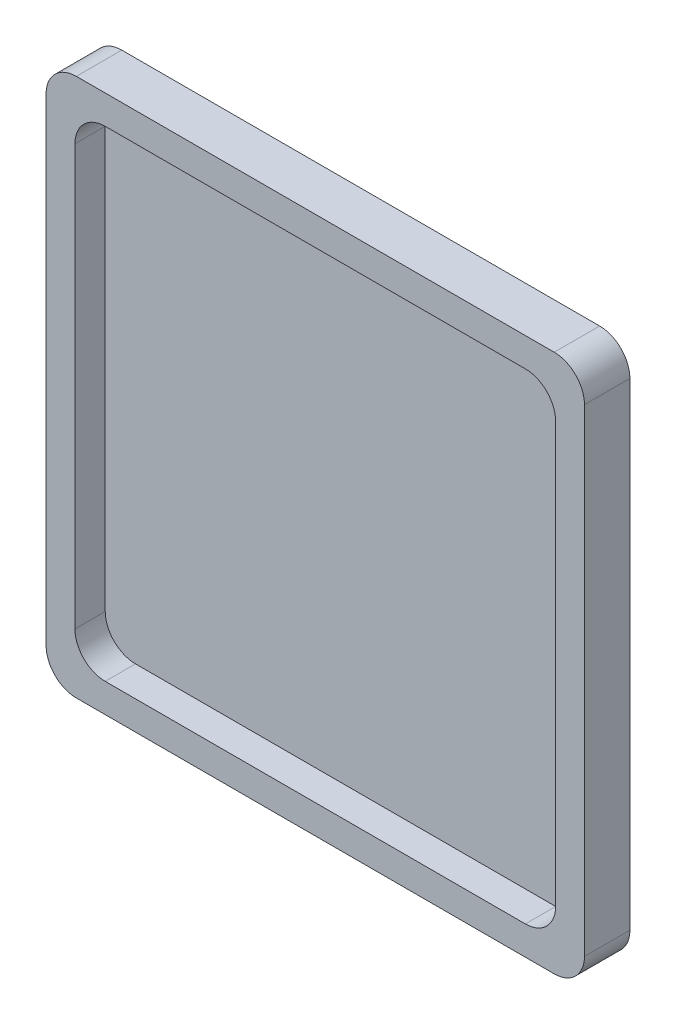
ISO-10303-21;
HEADER;
FILE_DESCRIPTION(('STEP AP214'),'2;1');
FILE_NAME('part.step','',(''),(''),'','','');
FILE_SCHEMA(('AUTOMOTIVE_DESIGN { 1 0 10303 214 1 1 1 1 }'));
ENDSEC;
DATA;
#1=APPLICATION_CONTEXT('core data for automotive mechanical design processes');
#2=APPLICATION_PROTOCOL_DEFINITION('international standard','automotive_design',2000,#1);
#3=PRODUCT_CONTEXT('',#1,'mechanical');
#4=PRODUCT('Part','Part','',(#3));
#5=PRODUCT_RELATED_PRODUCT_CATEGORY('part','',(#4));
#6=PRODUCT_DEFINITION_FORMATION('','',#4);
#7=PRODUCT_DEFINITION_CONTEXT('part definition',#1,'design');
#8=PRODUCT_DEFINITION('design','',#6,#7);
#9=PRODUCT_DEFINITION_SHAPE('','',#8);
#10=(LENGTH_UNIT() NAMED_UNIT(*) SI_UNIT(.MILLI.,.METRE.));
#11=(NAMED_UNIT(*) PLANE_ANGLE_UNIT() SI_UNIT($,.RADIAN.));
#12=(NAMED_UNIT(*) SI_UNIT($,.STERADIAN.) SOLID_ANGLE_UNIT());
#13=UNCERTAINTY_MEASURE_WITH_UNIT(LENGTH_MEASURE(1.E-05),#10,'distance_accuracy_value','');
#14=(GEOMETRIC_REPRESENTATION_CONTEXT(3) GLOBAL_UNCERTAINTY_ASSIGNED_CONTEXT((#13)) GLOBAL_UNIT_ASSIGNED_CONTEXT((#10,
#11,#12)) REPRESENTATION_CONTEXT('',''));
#15=CARTESIAN_POINT('',(0.,0.,0.));
#16=DIRECTION('',(0.,0.,1.));
#17=DIRECTION('',(1.,0.,0.));
#18=AXIS2_PLACEMENT_3D('',#15,#16,#17);
#19=CARTESIAN_POINT('',(0.,0.,0.));
#20=DIRECTION('',(0.,0.,1.));
#21=DIRECTION('',(1.,0.,0.));
#22=AXIS2_PLACEMENT_3D('',#19,#20,#21);
#23=PLANE('',#22);
#24=DIRECTION('',(0.,1.,0.));
#25=VECTOR('',#24,1.);
#26=CARTESIAN_POINT('',(186.685967034508,138.282663918857,0.));
#27=LINE('',#26,#25);
#28=CARTESIAN_POINT('',(186.685967034508,-29.5173360811433,0.));
#29=VERTEX_POINT('',#28);
#30=CARTESIAN_POINT('',(186.685967034508,128.282663918857,0.));
#31=VERTEX_POINT('',#30);
#32=EDGE_CURVE('E242',#29,#31,#27,.T.);
#33=ORIENTED_EDGE('',*,*,#32,.F.);
#34=CARTESIAN_POINT('',(176.685967034508,-29.5173360811433,0.));
#35=DIRECTION('',(0.,0.,1.));
#36=DIRECTION('',(1.,0.,0.));
#37=AXIS2_PLACEMENT_3D('',#34,#35,#36);
#38=CIRCLE('',#37,10.);
#39=CARTESIAN_POINT('',(176.685967034508,-39.5173360811434,0.));
#40=VERTEX_POINT('',#39);
#41=EDGE_CURVE('E257',#29,#40,#38,.F.);
#42=ORIENTED_EDGE('',*,*,#41,.T.);
#43=DIRECTION('',(1.,0.,0.));
#44=VECTOR('',#43,1.);
#45=CARTESIAN_POINT('',(8.88596703450786,-39.5173360811434,0.));
#46=LINE('',#45,#44);
#47=CARTESIAN_POINT('',(18.8859670345079,-39.5173360811434,0.));
#48=VERTEX_POINT('',#47);
#49=EDGE_CURVE('E239',#48,#40,#46,.T.);
#50=ORIENTED_EDGE('',*,*,#49,.F.);
#51=CARTESIAN_POINT('',(18.8859670345079,-29.5173360811434,0.));
#52=DIRECTION('',(0.,0.,1.));
#53=DIRECTION('',(1.,0.,0.));
#54=AXIS2_PLACEMENT_3D('',#51,#52,#53);
#55=CIRCLE('',#54,10.);
#56=CARTESIAN_POINT('',(8.88596703450786,-29.5173360811433,0.));
#57=VERTEX_POINT('',#56);
#58=EDGE_CURVE('E253',#48,#57,#55,.F.);
#59=ORIENTED_EDGE('',*,*,#58,.T.);
#60=DIRECTION('',(0.,-1.,0.));
#61=VECTOR('',#60,1.);
#62=CARTESIAN_POINT('',(8.88596703450784,138.282663918857,0.));
#63=LINE('',#62,#61);
#64=CARTESIAN_POINT('',(8.88596703450784,128.282663918857,0.));
#65=VERTEX_POINT('',#64);
#66=EDGE_CURVE('E214',#65,#57,#63,.T.);
#67=ORIENTED_EDGE('',*,*,#66,.F.);
#68=CARTESIAN_POINT('',(18.8859670345078,128.282663918857,0.));
#69=DIRECTION('',(0.,0.,1.));
#70=DIRECTION('',(1.,0.,0.));
#71=AXIS2_PLACEMENT_3D('',#68,#69,#70);
#72=CIRCLE('',#71,10.);
#73=CARTESIAN_POINT('',(18.8859670345078,138.282663918857,0.));
#74=VERTEX_POINT('',#73);
#75=EDGE_CURVE('E251',#65,#74,#72,.F.);
#76=ORIENTED_EDGE('',*,*,#75,.T.);
#77=DIRECTION('',(-1.,0.,0.));
#78=VECTOR('',#77,1.);
#79=CARTESIAN_POINT('',(8.88596703450784,138.282663918857,0.));
#80=LINE('',#79,#78);
#81=CARTESIAN_POINT('',(176.685967034508,138.282663918857,0.));
#82=VERTEX_POINT('',#81);
#83=EDGE_CURVE('E227',#82,#74,#80,.T.);
#84=ORIENTED_EDGE('',*,*,#83,.F.);
#85=CARTESIAN_POINT('',(176.685967034508,128.282663918857,0.));
#86=DIRECTION('',(0.,0.,1.));
#87=DIRECTION('',(1.,0.,0.));
#88=AXIS2_PLACEMENT_3D('',#85,#86,#87);
#89=CIRCLE('',#88,10.);
#90=EDGE_CURVE('E255',#82,#31,#89,.F.);
#91=ORIENTED_EDGE('',*,*,#90,.T.);
#92=EDGE_LOOP('',(#33,#42,#50,#59,#67,#76,#84,#91));
#93=FACE_BOUND('',#92,.T.);
#94=DIRECTION('',(0.,-1.,0.));
#95=VECTOR('',#94,1.);
#96=CARTESIAN_POINT('',(129.535967034508,17.6326639188566,0.));
#97=LINE('',#96,#95);
#98=CARTESIAN_POINT('',(129.535967034508,81.1326639188567,0.));
#99=VERTEX_POINT('',#98);
#100=CARTESIAN_POINT('',(129.535967034508,17.6326639188566,0.));
#101=VERTEX_POINT('',#100);
#102=EDGE_CURVE('E52',#99,#101,#97,.T.);
#103=ORIENTED_EDGE('',*,*,#102,.F.);
#104=DIRECTION('',(1.,0.,0.));
#105=VECTOR('',#104,1.);
#106=CARTESIAN_POINT('',(129.535967034508,81.1326639188567,0.));
#107=LINE('',#106,#105);
#108=CARTESIAN_POINT('',(66.0359670345078,81.1326639188567,0.));
#109=VERTEX_POINT('',#108);
#110=EDGE_CURVE('E56',#109,#99,#107,.T.);
#111=ORIENTED_EDGE('',*,*,#110,.F.);
#112=DIRECTION('',(0.,1.,0.));
#113=VECTOR('',#112,1.);
#114=CARTESIAN_POINT('',(66.0359670345078,17.6326639188566,0.));
#115=LINE('',#114,#113);
#116=CARTESIAN_POINT('',(66.0359670345078,17.6326639188566,0.));
#117=VERTEX_POINT('',#116);
#118=EDGE_CURVE('E587',#117,#109,#115,.T.);
#119=ORIENTED_EDGE('',*,*,#118,.F.);
#120=DIRECTION('',(-1.,0.,0.));
#121=VECTOR('',#120,1.);
#122=CARTESIAN_POINT('',(129.535967034508,17.6326639188566,0.));
#123=LINE('',#122,#121);
#124=EDGE_CURVE('E593',#101,#117,#123,.T.);
#125=ORIENTED_EDGE('',*,*,#124,.F.);
#126=EDGE_LOOP('',(#103,#111,#119,#125));
#127=FACE_BOUND('',#126,.T.);
#128=ADVANCED_FACE('F37',(#93,#127),#23,.F.);
#129=CARTESIAN_POINT('',(8.88596703450784,138.282663918857,15.));
#130=DIRECTION('',(1.,0.,0.));
#131=DIRECTION('',(0.,1.,0.));
#132=AXIS2_PLACEMENT_3D('',#129,#130,#131);
#133=PLANE('',#132);
#134=ORIENTED_EDGE('',*,*,#66,.T.);
#135=DIRECTION('',(0.,0.,-1.));
#136=VECTOR('',#135,1.);
#137=CARTESIAN_POINT('',(8.88596703450786,-29.5173360811433,15.));
#138=LINE('',#137,#136);
#139=CARTESIAN_POINT('',(8.88596703450786,-29.5173360811433,15.));
#140=VERTEX_POINT('',#139);
#141=EDGE_CURVE('E308',#57,#140,#138,.F.);
#142=ORIENTED_EDGE('',*,*,#141,.T.);
#143=DIRECTION('',(0.,-1.,0.));
#144=VECTOR('',#143,1.);
#145=CARTESIAN_POINT('',(8.88596703450784,138.282663918857,15.));
#146=LINE('',#145,#144);
#147=CARTESIAN_POINT('',(8.88596703450784,128.282663918857,15.));
#148=VERTEX_POINT('',#147);
#149=EDGE_CURVE('E223',#148,#140,#146,.T.);
#150=ORIENTED_EDGE('',*,*,#149,.F.);
#151=DIRECTION('',(0.,0.,-1.));
#152=VECTOR('',#151,1.);
#153=CARTESIAN_POINT('',(8.88596703450784,128.282663918857,15.));
#154=LINE('',#153,#152);
#155=EDGE_CURVE('E305',#148,#65,#154,.T.);
#156=ORIENTED_EDGE('',*,*,#155,.T.);
#157=EDGE_LOOP('',(#134,#142,#150,#156));
#158=FACE_BOUND('',#157,.T.);
#159=ADVANCED_FACE('F365',(#158),#133,.F.);
#160=CARTESIAN_POINT('',(8.88596703450786,-39.5173360811434,15.));
#161=DIRECTION('',(0.,1.,0.));
#162=DIRECTION('',(0.,0.,1.));
#163=AXIS2_PLACEMENT_3D('',#160,#161,#162);
#164=PLANE('',#163);
#165=ORIENTED_EDGE('',*,*,#49,.T.);
#166=DIRECTION('',(0.,0.,-1.));
#167=VECTOR('',#166,1.);
#168=CARTESIAN_POINT('',(176.685967034508,-39.5173360811434,15.));
#169=LINE('',#168,#167);
#170=CARTESIAN_POINT('',(176.685967034508,-39.5173360811434,15.));
#171=VERTEX_POINT('',#170);
#172=EDGE_CURVE('E262',#40,#171,#169,.F.);
#173=ORIENTED_EDGE('',*,*,#172,.T.);
#174=DIRECTION('',(1.,0.,0.));
#175=VECTOR('',#174,1.);
#176=CARTESIAN_POINT('',(8.88596703450786,-39.5173360811434,15.));
#177=LINE('',#176,#175);
#178=CARTESIAN_POINT('',(18.8859670345079,-39.5173360811434,15.));
#179=VERTEX_POINT('',#178);
#180=EDGE_CURVE('E226',#179,#171,#177,.T.);
#181=ORIENTED_EDGE('',*,*,#180,.F.);
#182=DIRECTION('',(0.,0.,-1.));
#183=VECTOR('',#182,1.);
#184=CARTESIAN_POINT('',(18.8859670345079,-39.5173360811434,15.));
#185=LINE('',#184,#183);
#186=EDGE_CURVE('E259',#179,#48,#185,.T.);
#187=ORIENTED_EDGE('',*,*,#186,.T.);
#188=EDGE_LOOP('',(#165,#173,#181,#187));
#189=FACE_BOUND('',#188,.T.);
#190=ADVANCED_FACE('F371',(#189),#164,.F.);
#191=CARTESIAN_POINT('',(186.685967034508,138.282663918857,15.));
#192=DIRECTION('',(-1.,0.,0.));
#193=DIRECTION('',(0.,0.,1.));
#194=AXIS2_PLACEMENT_3D('',#191,#192,#193);
#195=PLANE('',#194);
#196=DIRECTION('',(0.,1.,0.));
#197=VECTOR('',#196,1.);
#198=CARTESIAN_POINT('',(186.685967034508,138.282663918857,15.));
#199=LINE('',#198,#197);
#200=CARTESIAN_POINT('',(186.685967034508,-29.5173360811433,15.));
#201=VERTEX_POINT('',#200);
#202=CARTESIAN_POINT('',(186.685967034508,128.282663918857,15.));
#203=VERTEX_POINT('',#202);
#204=EDGE_CURVE('E230',#201,#203,#199,.T.);
#205=ORIENTED_EDGE('',*,*,#204,.F.);
#206=DIRECTION('',(0.,0.,-1.));
#207=VECTOR('',#206,1.);
#208=CARTESIAN_POINT('',(186.685967034508,-29.5173360811433,15.));
#209=LINE('',#208,#207);
#210=EDGE_CURVE('E248',#201,#29,#209,.T.);
#211=ORIENTED_EDGE('',*,*,#210,.T.);
#212=ORIENTED_EDGE('',*,*,#32,.T.);
#213=DIRECTION('',(0.,0.,-1.));
#214=VECTOR('',#213,1.);
#215=CARTESIAN_POINT('',(186.685967034508,128.282663918857,15.));
#216=LINE('',#215,#214);
#217=EDGE_CURVE('E236',#31,#203,#216,.F.);
#218=ORIENTED_EDGE('',*,*,#217,.T.);
#219=EDGE_LOOP('',(#205,#211,#212,#218));
#220=FACE_BOUND('',#219,.T.);
#221=ADVANCED_FACE('F381',(#220),#195,.F.);
#222=CARTESIAN_POINT('',(8.88596703450784,138.282663918857,15.));
#223=DIRECTION('',(0.,-1.,0.));
#224=DIRECTION('',(0.,0.,-1.));
#225=AXIS2_PLACEMENT_3D('',#222,#223,#224);
#226=PLANE('',#225);
#227=DIRECTION('',(-1.,0.,0.));
#228=VECTOR('',#227,1.);
#229=CARTESIAN_POINT('',(8.88596703450784,138.282663918857,15.));
#230=LINE('',#229,#228);
#231=CARTESIAN_POINT('',(176.685967034508,138.282663918857,15.));
#232=VERTEX_POINT('',#231);
#233=CARTESIAN_POINT('',(18.8859670345078,138.282663918857,15.));
#234=VERTEX_POINT('',#233);
#235=EDGE_CURVE('E233',#232,#234,#230,.T.);
#236=ORIENTED_EDGE('',*,*,#235,.F.);
#237=DIRECTION('',(0.,0.,-1.));
#238=VECTOR('',#237,1.);
#239=CARTESIAN_POINT('',(176.685967034508,138.282663918857,15.));
#240=LINE('',#239,#238);
#241=EDGE_CURVE('E302',#232,#82,#240,.T.);
#242=ORIENTED_EDGE('',*,*,#241,.T.);
#243=ORIENTED_EDGE('',*,*,#83,.T.);
#244=DIRECTION('',(0.,0.,-1.));
#245=VECTOR('',#244,1.);
#246=CARTESIAN_POINT('',(18.8859670345078,138.282663918857,15.));
#247=LINE('',#246,#245);
#248=EDGE_CURVE('E300',#74,#234,#247,.F.);
#249=ORIENTED_EDGE('',*,*,#248,.T.);
#250=EDGE_LOOP('',(#236,#242,#243,#249));
#251=FACE_BOUND('',#250,.T.);
#252=ADVANCED_FACE('F378',(#251),#226,.F.);
#253=CARTESIAN_POINT('',(0.,0.,15.));
#254=DIRECTION('',(0.,0.,1.));
#255=DIRECTION('',(1.,0.,0.));
#256=AXIS2_PLACEMENT_3D('',#253,#254,#255);
#257=PLANE('',#256);
#258=DIRECTION('',(0.,1.,0.));
#259=VECTOR('',#258,1.);
#260=CARTESIAN_POINT('',(177.160967034508,-29.9923360811434,15.));
#261=LINE('',#260,#259);
#262=CARTESIAN_POINT('',(177.160967034508,-19.9923360811434,15.));
#263=VERTEX_POINT('',#262);
#264=CARTESIAN_POINT('',(177.160967034508,118.757663918857,15.));
#265=VERTEX_POINT('',#264);
#266=EDGE_CURVE('E193',#263,#265,#261,.T.);
#267=ORIENTED_EDGE('',*,*,#266,.F.);
#268=CARTESIAN_POINT('',(167.160967034508,-19.9923360811434,15.));
#269=DIRECTION('',(0.,0.,1.));
#270=DIRECTION('',(1.,0.,0.));
#271=AXIS2_PLACEMENT_3D('',#268,#269,#270);
#272=CIRCLE('',#271,10.);
#273=CARTESIAN_POINT('',(167.160967034508,-29.9923360811434,15.));
#274=VERTEX_POINT('',#273);
#275=EDGE_CURVE('E11',#263,#274,#272,.F.);
#276=ORIENTED_EDGE('',*,*,#275,.T.);
#277=DIRECTION('',(1.,0.,0.));
#278=VECTOR('',#277,1.);
#279=CARTESIAN_POINT('',(177.160967034508,-29.9923360811434,15.));
#280=LINE('',#279,#278);
#281=CARTESIAN_POINT('',(28.4109670345078,-29.9923360811434,15.));
#282=VERTEX_POINT('',#281);
#283=EDGE_CURVE('E206',#282,#274,#280,.T.);
#284=ORIENTED_EDGE('',*,*,#283,.F.);
#285=CARTESIAN_POINT('',(28.4109670345078,-19.9923360811434,15.));
#286=DIRECTION('',(0.,0.,1.));
#287=DIRECTION('',(1.,0.,0.));
#288=AXIS2_PLACEMENT_3D('',#285,#286,#287);
#289=CIRCLE('',#288,10.);
#290=CARTESIAN_POINT('',(18.4109670345078,-19.9923360811434,15.));
#291=VERTEX_POINT('',#290);
#292=EDGE_CURVE('E45',#282,#291,#289,.F.);
#293=ORIENTED_EDGE('',*,*,#292,.T.);
#294=DIRECTION('',(0.,-1.,0.));
#295=VECTOR('',#294,1.);
#296=CARTESIAN_POINT('',(18.4109670345078,-29.9923360811434,15.));
#297=LINE('',#296,#295);
#298=CARTESIAN_POINT('',(18.4109670345078,118.757663918857,15.));
#299=VERTEX_POINT('',#298);
#300=EDGE_CURVE('E218',#299,#291,#297,.T.);
#301=ORIENTED_EDGE('',*,*,#300,.F.);
#302=CARTESIAN_POINT('',(28.4109670345078,118.757663918857,15.));
#303=DIRECTION('',(0.,0.,1.));
#304=DIRECTION('',(1.,0.,0.));
#305=AXIS2_PLACEMENT_3D('',#302,#303,#304);
#306=CIRCLE('',#305,10.);
#307=CARTESIAN_POINT('',(28.4109670345078,128.757663918857,15.));
#308=VERTEX_POINT('',#307);
#309=EDGE_CURVE('E310',#299,#308,#306,.F.);
#310=ORIENTED_EDGE('',*,*,#309,.T.);
#311=DIRECTION('',(-1.,0.,0.));
#312=VECTOR('',#311,1.);
#313=CARTESIAN_POINT('',(177.160967034508,128.757663918857,15.));
#314=LINE('',#313,#312);
#315=CARTESIAN_POINT('',(167.160967034508,128.757663918857,15.));
#316=VERTEX_POINT('',#315);
#317=EDGE_CURVE('E196',#316,#308,#314,.T.);
#318=ORIENTED_EDGE('',*,*,#317,.F.);
#319=CARTESIAN_POINT('',(167.160967034508,118.757663918857,15.));
#320=DIRECTION('',(0.,0.,1.));
#321=DIRECTION('',(1.,0.,0.));
#322=AXIS2_PLACEMENT_3D('',#319,#320,#321);
#323=CIRCLE('',#322,10.);
#324=EDGE_CURVE('E312',#316,#265,#323,.F.);
#325=ORIENTED_EDGE('',*,*,#324,.T.);
#326=EDGE_LOOP('',(#267,#276,#284,#293,#301,#310,#318,#325));
#327=FACE_BOUND('',#326,.T.);
#328=ORIENTED_EDGE('',*,*,#180,.T.);
#329=CARTESIAN_POINT('',(176.685967034508,-29.5173360811433,15.));
#330=DIRECTION('',(0.,0.,1.));
#331=DIRECTION('',(1.,0.,0.));
#332=AXIS2_PLACEMENT_3D('',#329,#330,#331);
#333=CIRCLE('',#332,10.);
#334=EDGE_CURVE('E270',#171,#201,#333,.T.);
#335=ORIENTED_EDGE('',*,*,#334,.T.);
#336=ORIENTED_EDGE('',*,*,#204,.T.);
#337=CARTESIAN_POINT('',(176.685967034508,128.282663918857,15.));
#338=DIRECTION('',(0.,0.,1.));
#339=DIRECTION('',(1.,0.,0.));
#340=AXIS2_PLACEMENT_3D('',#337,#338,#339);
#341=CIRCLE('',#340,10.);
#342=EDGE_CURVE('E268',#203,#232,#341,.T.);
#343=ORIENTED_EDGE('',*,*,#342,.T.);
#344=ORIENTED_EDGE('',*,*,#235,.T.);
#345=CARTESIAN_POINT('',(18.8859670345078,128.282663918857,15.));
#346=DIRECTION('',(0.,0.,1.));
#347=DIRECTION('',(1.,0.,0.));
#348=AXIS2_PLACEMENT_3D('',#345,#346,#347);
#349=CIRCLE('',#348,10.);
#350=EDGE_CURVE('E264',#234,#148,#349,.T.);
#351=ORIENTED_EDGE('',*,*,#350,.T.);
#352=ORIENTED_EDGE('',*,*,#149,.T.);
#353=CARTESIAN_POINT('',(18.8859670345079,-29.5173360811434,15.));
#354=DIRECTION('',(0.,0.,1.));
#355=DIRECTION('',(1.,0.,0.));
#356=AXIS2_PLACEMENT_3D('',#353,#354,#355);
#357=CIRCLE('',#356,10.);
#358=EDGE_CURVE('E266',#140,#179,#357,.T.);
#359=ORIENTED_EDGE('',*,*,#358,.T.);
#360=EDGE_LOOP('',(#328,#335,#336,#343,#344,#351,#352,#359));
#361=FACE_BOUND('',#360,.T.);
#362=ADVANCED_FACE('F317',(#327,#361),#257,.T.);
#363=CARTESIAN_POINT('',(177.160967034508,-29.9923360811434,5.));
#364=DIRECTION('',(1.,0.,0.));
#365=DIRECTION('',(0.,1.,0.));
#366=AXIS2_PLACEMENT_3D('',#363,#364,#365);
#367=PLANE('',#366);
#368=ORIENTED_EDGE('',*,*,#266,.T.);
#369=DIRECTION('',(0.,0.,1.));
#370=VECTOR('',#369,1.);
#371=CARTESIAN_POINT('',(177.160967034508,118.757663918857,5.));
#372=LINE('',#371,#370);
#373=CARTESIAN_POINT('',(177.160967034508,118.757663918857,5.));
#374=VERTEX_POINT('',#373);
#375=EDGE_CURVE('E293',#265,#374,#372,.F.);
#376=ORIENTED_EDGE('',*,*,#375,.T.);
#377=DIRECTION('',(0.,1.,0.));
#378=VECTOR('',#377,1.);
#379=CARTESIAN_POINT('',(177.160967034508,-29.9923360811434,5.));
#380=LINE('',#379,#378);
#381=CARTESIAN_POINT('',(177.160967034508,-19.9923360811434,5.));
#382=VERTEX_POINT('',#381);
#383=EDGE_CURVE('E202',#382,#374,#380,.T.);
#384=ORIENTED_EDGE('',*,*,#383,.F.);
#385=DIRECTION('',(0.,0.,1.));
#386=VECTOR('',#385,1.);
#387=CARTESIAN_POINT('',(177.160967034508,-19.9923360811434,15.));
#388=LINE('',#387,#386);
#389=EDGE_CURVE('E290',#382,#263,#388,.T.);
#390=ORIENTED_EDGE('',*,*,#389,.T.);
#391=EDGE_LOOP('',(#368,#376,#384,#390));
#392=FACE_BOUND('',#391,.T.);
#393=ADVANCED_FACE('F341',(#392),#367,.F.);
#394=CARTESIAN_POINT('',(177.160967034508,-29.9923360811434,5.));
#395=DIRECTION('',(0.,-1.,0.));
#396=DIRECTION('',(1.,0.,0.));
#397=AXIS2_PLACEMENT_3D('',#394,#395,#396);
#398=PLANE('',#397);
#399=DIRECTION('',(1.,0.,0.));
#400=VECTOR('',#399,1.);
#401=CARTESIAN_POINT('',(177.160967034508,-29.9923360811434,5.));
#402=LINE('',#401,#400);
#403=CARTESIAN_POINT('',(28.4109670345078,-29.9923360811434,5.));
#404=VERTEX_POINT('',#403);
#405=CARTESIAN_POINT('',(167.160967034508,-29.9923360811434,5.));
#406=VERTEX_POINT('',#405);
#407=EDGE_CURVE('E212',#404,#406,#402,.T.);
#408=ORIENTED_EDGE('',*,*,#407,.F.);
#409=DIRECTION('',(0.,0.,1.));
#410=VECTOR('',#409,1.);
#411=CARTESIAN_POINT('',(28.4109670345078,-29.9923360811434,15.));
#412=LINE('',#411,#410);
#413=EDGE_CURVE('E297',#404,#282,#412,.T.);
#414=ORIENTED_EDGE('',*,*,#413,.T.);
#415=ORIENTED_EDGE('',*,*,#283,.T.);
#416=DIRECTION('',(0.,0.,1.));
#417=VECTOR('',#416,1.);
#418=CARTESIAN_POINT('',(167.160967034508,-29.9923360811434,5.));
#419=LINE('',#418,#417);
#420=EDGE_CURVE('E295',#274,#406,#419,.F.);
#421=ORIENTED_EDGE('',*,*,#420,.T.);
#422=EDGE_LOOP('',(#408,#414,#415,#421));
#423=FACE_BOUND('',#422,.T.);
#424=ADVANCED_FACE('F333',(#423),#398,.F.);
#425=CARTESIAN_POINT('',(18.4109670345078,-29.9923360811434,5.));
#426=DIRECTION('',(-1.,0.,0.));
#427=DIRECTION('',(0.,0.,1.));
#428=AXIS2_PLACEMENT_3D('',#425,#426,#427);
#429=PLANE('',#428);
#430=DIRECTION('',(0.,-1.,0.));
#431=VECTOR('',#430,1.);
#432=CARTESIAN_POINT('',(18.4109670345078,-29.9923360811434,5.));
#433=LINE('',#432,#431);
#434=CARTESIAN_POINT('',(18.4109670345078,118.757663918857,5.));
#435=VERTEX_POINT('',#434);
#436=CARTESIAN_POINT('',(18.4109670345078,-19.9923360811434,5.));
#437=VERTEX_POINT('',#436);
#438=EDGE_CURVE('E209',#435,#437,#433,.T.);
#439=ORIENTED_EDGE('',*,*,#438,.F.);
#440=DIRECTION('',(0.,0.,1.));
#441=VECTOR('',#440,1.);
#442=CARTESIAN_POINT('',(18.4109670345078,118.757663918857,15.));
#443=LINE('',#442,#441);
#444=EDGE_CURVE('E274',#435,#299,#443,.T.);
#445=ORIENTED_EDGE('',*,*,#444,.T.);
#446=ORIENTED_EDGE('',*,*,#300,.T.);
#447=DIRECTION('',(0.,0.,1.));
#448=VECTOR('',#447,1.);
#449=CARTESIAN_POINT('',(18.4109670345078,-19.9923360811434,5.));
#450=LINE('',#449,#448);
#451=EDGE_CURVE('E272',#291,#437,#450,.F.);
#452=ORIENTED_EDGE('',*,*,#451,.T.);
#453=EDGE_LOOP('',(#439,#445,#446,#452));
#454=FACE_BOUND('',#453,.T.);
#455=ADVANCED_FACE('F324',(#454),#429,.F.);
#456=CARTESIAN_POINT('',(177.160967034508,128.757663918857,5.));
#457=DIRECTION('',(0.,1.,0.));
#458=DIRECTION('',(-1.,0.,0.));
#459=AXIS2_PLACEMENT_3D('',#456,#457,#458);
#460=PLANE('',#459);
#461=ORIENTED_EDGE('',*,*,#317,.T.);
#462=DIRECTION('',(0.,0.,1.));
#463=VECTOR('',#462,1.);
#464=CARTESIAN_POINT('',(28.4109670345078,128.757663918857,5.));
#465=LINE('',#464,#463);
#466=CARTESIAN_POINT('',(28.4109670345078,128.757663918857,5.));
#467=VERTEX_POINT('',#466);
#468=EDGE_CURVE('E280',#308,#467,#465,.F.);
#469=ORIENTED_EDGE('',*,*,#468,.T.);
#470=DIRECTION('',(-1.,0.,0.));
#471=VECTOR('',#470,1.);
#472=CARTESIAN_POINT('',(177.160967034508,128.757663918857,5.));
#473=LINE('',#472,#471);
#474=CARTESIAN_POINT('',(167.160967034508,128.757663918857,5.));
#475=VERTEX_POINT('',#474);
#476=EDGE_CURVE('E205',#475,#467,#473,.T.);
#477=ORIENTED_EDGE('',*,*,#476,.F.);
#478=DIRECTION('',(0.,0.,1.));
#479=VECTOR('',#478,1.);
#480=CARTESIAN_POINT('',(167.160967034508,128.757663918857,15.));
#481=LINE('',#480,#479);
#482=EDGE_CURVE('E277',#475,#316,#481,.T.);
#483=ORIENTED_EDGE('',*,*,#482,.T.);
#484=EDGE_LOOP('',(#461,#469,#477,#483));
#485=FACE_BOUND('',#484,.T.);
#486=ADVANCED_FACE('F349',(#485),#460,.F.);
#487=CARTESIAN_POINT('',(0.,0.,5.));
#488=DIRECTION('',(0.,0.,1.));
#489=DIRECTION('',(1.,0.,0.));
#490=AXIS2_PLACEMENT_3D('',#487,#488,#489);
#491=PLANE('',#490);
#492=ORIENTED_EDGE('',*,*,#476,.T.);
#493=CARTESIAN_POINT('',(28.4109670345078,118.757663918857,5.));
#494=DIRECTION('',(0.,0.,1.));
#495=DIRECTION('',(1.,0.,0.));
#496=AXIS2_PLACEMENT_3D('',#493,#494,#495);
#497=CIRCLE('',#496,10.);
#498=EDGE_CURVE('E288',#467,#435,#497,.T.);
#499=ORIENTED_EDGE('',*,*,#498,.T.);
#500=ORIENTED_EDGE('',*,*,#438,.T.);
#501=CARTESIAN_POINT('',(28.4109670345078,-19.9923360811434,5.));
#502=DIRECTION('',(0.,0.,1.));
#503=DIRECTION('',(1.,0.,0.));
#504=AXIS2_PLACEMENT_3D('',#501,#502,#503);
#505=CIRCLE('',#504,10.);
#506=EDGE_CURVE('E284',#437,#404,#505,.T.);
#507=ORIENTED_EDGE('',*,*,#506,.T.);
#508=ORIENTED_EDGE('',*,*,#407,.T.);
#509=CARTESIAN_POINT('',(167.160967034508,-19.9923360811434,5.));
#510=DIRECTION('',(0.,0.,1.));
#511=DIRECTION('',(1.,0.,0.));
#512=AXIS2_PLACEMENT_3D('',#509,#510,#511);
#513=CIRCLE('',#512,10.);
#514=EDGE_CURVE('E282',#406,#382,#513,.T.);
#515=ORIENTED_EDGE('',*,*,#514,.T.);
#516=ORIENTED_EDGE('',*,*,#383,.T.);
#517=CARTESIAN_POINT('',(167.160967034508,118.757663918857,5.));
#518=DIRECTION('',(0.,0.,1.));
#519=DIRECTION('',(1.,0.,0.));
#520=AXIS2_PLACEMENT_3D('',#517,#518,#519);
#521=CIRCLE('',#520,10.);
#522=EDGE_CURVE('E286',#374,#475,#521,.T.);
#523=ORIENTED_EDGE('',*,*,#522,.T.);
#524=EDGE_LOOP('',(#492,#499,#500,#507,#508,#515,#516,#523));
#525=FACE_BOUND('',#524,.T.);
#526=ADVANCED_FACE('F330',(#525),#491,.T.);
#527=CARTESIAN_POINT('',(176.685967034508,-29.5173360811433,15.));
#528=DIRECTION('',(0.,0.,-1.));
#529=DIRECTION('',(-1.,0.,0.));
#530=AXIS2_PLACEMENT_3D('',#527,#528,#529);
#531=CYLINDRICAL_SURFACE('',#530,10.);
#532=ORIENTED_EDGE('',*,*,#334,.F.);
#533=ORIENTED_EDGE('',*,*,#172,.F.);
#534=ORIENTED_EDGE('',*,*,#41,.F.);
#535=ORIENTED_EDGE('',*,*,#210,.F.);
#536=EDGE_LOOP('',(#532,#533,#534,#535));
#537=FACE_BOUND('',#536,.T.);
#538=ADVANCED_FACE('F355',(#537),#531,.T.);
#539=CARTESIAN_POINT('',(28.4109670345078,118.757663918857,5.));
#540=DIRECTION('',(0.,0.,-1.));
#541=DIRECTION('',(-1.,0.,0.));
#542=AXIS2_PLACEMENT_3D('',#539,#540,#541);
#543=CYLINDRICAL_SURFACE('',#542,10.);
#544=ORIENTED_EDGE('',*,*,#498,.F.);
#545=ORIENTED_EDGE('',*,*,#468,.F.);
#546=ORIENTED_EDGE('',*,*,#309,.F.);
#547=ORIENTED_EDGE('',*,*,#444,.F.);
#548=EDGE_LOOP('',(#544,#545,#546,#547));
#549=FACE_BOUND('',#548,.T.);
#550=ADVANCED_FACE('F353',(#549),#543,.F.);
#551=CARTESIAN_POINT('',(167.160967034508,118.757663918857,5.));
#552=DIRECTION('',(0.,0.,-1.));
#553=DIRECTION('',(-1.,0.,0.));
#554=AXIS2_PLACEMENT_3D('',#551,#552,#553);
#555=CYLINDRICAL_SURFACE('',#554,10.);
#556=ORIENTED_EDGE('',*,*,#522,.F.);
#557=ORIENTED_EDGE('',*,*,#375,.F.);
#558=ORIENTED_EDGE('',*,*,#324,.F.);
#559=ORIENTED_EDGE('',*,*,#482,.F.);
#560=EDGE_LOOP('',(#556,#557,#558,#559));
#561=FACE_BOUND('',#560,.T.);
#562=ADVANCED_FACE('F344',(#561),#555,.F.);
#563=CARTESIAN_POINT('',(28.4109670345078,-19.9923360811434,5.));
#564=DIRECTION('',(0.,0.,-1.));
#565=DIRECTION('',(-1.,0.,0.));
#566=AXIS2_PLACEMENT_3D('',#563,#564,#565);
#567=CYLINDRICAL_SURFACE('',#566,10.);
#568=ORIENTED_EDGE('',*,*,#506,.F.);
#569=ORIENTED_EDGE('',*,*,#451,.F.);
#570=ORIENTED_EDGE('',*,*,#292,.F.);
#571=ORIENTED_EDGE('',*,*,#413,.F.);
#572=EDGE_LOOP('',(#568,#569,#570,#571));
#573=FACE_BOUND('',#572,.T.);
#574=ADVANCED_FACE('F327',(#573),#567,.F.);
#575=CARTESIAN_POINT('',(167.160967034508,-19.9923360811434,5.));
#576=DIRECTION('',(0.,0.,-1.));
#577=DIRECTION('',(-1.,0.,0.));
#578=AXIS2_PLACEMENT_3D('',#575,#576,#577);
#579=CYLINDRICAL_SURFACE('',#578,10.);
#580=ORIENTED_EDGE('',*,*,#514,.F.);
#581=ORIENTED_EDGE('',*,*,#420,.F.);
#582=ORIENTED_EDGE('',*,*,#275,.F.);
#583=ORIENTED_EDGE('',*,*,#389,.F.);
#584=EDGE_LOOP('',(#580,#581,#582,#583));
#585=FACE_BOUND('',#584,.T.);
#586=ADVANCED_FACE('F336',(#585),#579,.F.);
#587=CARTESIAN_POINT('',(176.685967034508,128.282663918857,15.));
#588=DIRECTION('',(0.,0.,-1.));
#589=DIRECTION('',(-1.,0.,0.));
#590=AXIS2_PLACEMENT_3D('',#587,#588,#589);
#591=CYLINDRICAL_SURFACE('',#590,10.);
#592=ORIENTED_EDGE('',*,*,#342,.F.);
#593=ORIENTED_EDGE('',*,*,#217,.F.);
#594=ORIENTED_EDGE('',*,*,#90,.F.);
#595=ORIENTED_EDGE('',*,*,#241,.F.);
#596=EDGE_LOOP('',(#592,#593,#594,#595));
#597=FACE_BOUND('',#596,.T.);
#598=ADVANCED_FACE('F400',(#597),#591,.T.);
#599=CARTESIAN_POINT('',(18.8859670345079,-29.5173360811434,15.));
#600=DIRECTION('',(0.,0.,-1.));
#601=DIRECTION('',(-1.,0.,0.));
#602=AXIS2_PLACEMENT_3D('',#599,#600,#601);
#603=CYLINDRICAL_SURFACE('',#602,10.);
#604=ORIENTED_EDGE('',*,*,#358,.F.);
#605=ORIENTED_EDGE('',*,*,#141,.F.);
#606=ORIENTED_EDGE('',*,*,#58,.F.);
#607=ORIENTED_EDGE('',*,*,#186,.F.);
#608=EDGE_LOOP('',(#604,#605,#606,#607));
#609=FACE_BOUND('',#608,.T.);
#610=ADVANCED_FACE('F413',(#609),#603,.T.);
#611=CARTESIAN_POINT('',(18.8859670345078,128.282663918857,15.));
#612=DIRECTION('',(0.,0.,-1.));
#613=DIRECTION('',(-1.,0.,0.));
#614=AXIS2_PLACEMENT_3D('',#611,#612,#613);
#615=CYLINDRICAL_SURFACE('',#614,10.);
#616=ORIENTED_EDGE('',*,*,#350,.F.);
#617=ORIENTED_EDGE('',*,*,#248,.F.);
#618=ORIENTED_EDGE('',*,*,#75,.F.);
#619=ORIENTED_EDGE('',*,*,#155,.F.);
#620=EDGE_LOOP('',(#616,#617,#618,#619));
#621=FACE_BOUND('',#620,.T.);
#622=ADVANCED_FACE('F39',(#621),#615,.T.);
#623=CARTESIAN_POINT('',(129.535967034508,17.6326639188566,-10.));
#624=DIRECTION('',(-1.,0.,0.));
#625=DIRECTION('',(0.,0.,1.));
#626=AXIS2_PLACEMENT_3D('',#623,#624,#625);
#627=PLANE('',#626);
#628=ORIENTED_EDGE('',*,*,#102,.T.);
#629=DIRECTION('',(0.,0.,1.));
#630=VECTOR('',#629,1.);
#631=CARTESIAN_POINT('',(129.535967034508,17.6326639188566,-10.));
#632=LINE('',#631,#630);
#633=CARTESIAN_POINT('',(129.535967034508,17.6326639188566,-10.));
#634=VERTEX_POINT('',#633);
#635=EDGE_CURVE('E176',#634,#101,#632,.T.);
#636=ORIENTED_EDGE('',*,*,#635,.F.);
#637=DIRECTION('',(0.,-1.,0.));
#638=VECTOR('',#637,1.);
#639=CARTESIAN_POINT('',(129.535967034508,17.6326639188566,-10.));
#640=LINE('',#639,#638);
#641=CARTESIAN_POINT('',(129.535967034508,81.1326639188567,-10.));
#642=VERTEX_POINT('',#641);
#643=EDGE_CURVE('E182',#642,#634,#640,.T.);
#644=ORIENTED_EDGE('',*,*,#643,.F.);
#645=DIRECTION('',(0.,0.,1.));
#646=VECTOR('',#645,1.);
#647=CARTESIAN_POINT('',(129.535967034508,81.1326639188567,-10.));
#648=LINE('',#647,#646);
#649=EDGE_CURVE('E585',#642,#99,#648,.T.);
#650=ORIENTED_EDGE('',*,*,#649,.T.);
#651=EDGE_LOOP('',(#628,#636,#644,#650));
#652=FACE_BOUND('',#651,.T.);
#653=ADVANCED_FACE('F192',(#652),#627,.F.);
#654=CARTESIAN_POINT('',(129.535967034508,17.6326639188566,-10.));
#655=DIRECTION('',(0.,1.,0.));
#656=DIRECTION('',(0.,0.,1.));
#657=AXIS2_PLACEMENT_3D('',#654,#655,#656);
#658=PLANE('',#657);
#659=ORIENTED_EDGE('',*,*,#124,.T.);
#660=DIRECTION('',(0.,0.,1.));
#661=VECTOR('',#660,1.);
#662=CARTESIAN_POINT('',(66.0359670345078,17.6326639188566,-10.));
#663=LINE('',#662,#661);
#664=CARTESIAN_POINT('',(66.0359670345078,17.6326639188566,-10.));
#665=VERTEX_POINT('',#664);
#666=EDGE_CURVE('E178',#665,#117,#663,.T.);
#667=ORIENTED_EDGE('',*,*,#666,.F.);
#668=DIRECTION('',(-1.,0.,0.));
#669=VECTOR('',#668,1.);
#670=CARTESIAN_POINT('',(129.535967034508,17.6326639188566,-10.));
#671=LINE('',#670,#669);
#672=EDGE_CURVE('E171',#634,#665,#671,.T.);
#673=ORIENTED_EDGE('',*,*,#672,.F.);
#674=ORIENTED_EDGE('',*,*,#635,.T.);
#675=EDGE_LOOP('',(#659,#667,#673,#674));
#676=FACE_BOUND('',#675,.T.);
#677=ADVANCED_FACE('F174',(#676),#658,.F.);
#678=CARTESIAN_POINT('',(66.0359670345078,17.6326639188566,-10.));
#679=DIRECTION('',(1.,0.,0.));
#680=DIRECTION('',(0.,0.,-1.));
#681=AXIS2_PLACEMENT_3D('',#678,#679,#680);
#682=PLANE('',#681);
#683=ORIENTED_EDGE('',*,*,#118,.T.);
#684=DIRECTION('',(0.,0.,1.));
#685=VECTOR('',#684,1.);
#686=CARTESIAN_POINT('',(66.0359670345078,81.1326639188567,-10.));
#687=LINE('',#686,#685);
#688=CARTESIAN_POINT('',(66.0359670345078,81.1326639188567,-10.));
#689=VERTEX_POINT('',#688);
#690=EDGE_CURVE('E198',#689,#109,#687,.T.);
#691=ORIENTED_EDGE('',*,*,#690,.F.);
#692=DIRECTION('',(0.,1.,0.));
#693=VECTOR('',#692,1.);
#694=CARTESIAN_POINT('',(66.0359670345078,17.6326639188566,-10.));
#695=LINE('',#694,#693);
#696=EDGE_CURVE('E181',#665,#689,#695,.T.);
#697=ORIENTED_EDGE('',*,*,#696,.F.);
#698=ORIENTED_EDGE('',*,*,#666,.T.);
#699=EDGE_LOOP('',(#683,#691,#697,#698));
#700=FACE_BOUND('',#699,.T.);
#701=ADVANCED_FACE('F467',(#700),#682,.F.);
#702=CARTESIAN_POINT('',(129.535967034508,81.1326639188567,-10.));
#703=DIRECTION('',(0.,-1.,0.));
#704=DIRECTION('',(0.,0.,-1.));
#705=AXIS2_PLACEMENT_3D('',#702,#703,#704);
#706=PLANE('',#705);
#707=ORIENTED_EDGE('',*,*,#110,.T.);
#708=ORIENTED_EDGE('',*,*,#649,.F.);
#709=DIRECTION('',(1.,0.,0.));
#710=VECTOR('',#709,1.);
#711=CARTESIAN_POINT('',(129.535967034508,81.1326639188567,-10.));
#712=LINE('',#711,#710);
#713=EDGE_CURVE('E187',#689,#642,#712,.T.);
#714=ORIENTED_EDGE('',*,*,#713,.F.);
#715=ORIENTED_EDGE('',*,*,#690,.T.);
#716=EDGE_LOOP('',(#707,#708,#714,#715));
#717=FACE_BOUND('',#716,.T.);
#718=ADVANCED_FACE('F476',(#717),#706,.F.);
#719=CARTESIAN_POINT('',(0.,0.,-10.));
#720=DIRECTION('',(0.,0.,1.));
#721=DIRECTION('',(1.,0.,0.));
#722=AXIS2_PLACEMENT_3D('',#719,#720,#721);
#723=PLANE('',#722);
#724=ORIENTED_EDGE('',*,*,#643,.T.);
#725=ORIENTED_EDGE('',*,*,#672,.T.);
#726=ORIENTED_EDGE('',*,*,#696,.T.);
#727=ORIENTED_EDGE('',*,*,#713,.T.);
#728=EDGE_LOOP('',(#724,#725,#726,#727));
#729=FACE_BOUND('',#728,.T.);
#730=ADVANCED_FACE('F185',(#729),#723,.F.);
#731=CLOSED_SHELL('',(#128,#159,#190,#221,#252,#362,#393,#424,#455,#486,#526,#538,#550,#562,
#574,#586,#598,#610,#622,#653,#677,#701,#718,#730));
#732=MANIFOLD_SOLID_BREP('B2',#731);
#733=ADVANCED_BREP_SHAPE_REPRESENTATION('',(#18,#732),#14);
#734=SHAPE_DEFINITION_REPRESENTATION(#9,#733);
ENDSEC;
END-ISO-10303-21;
